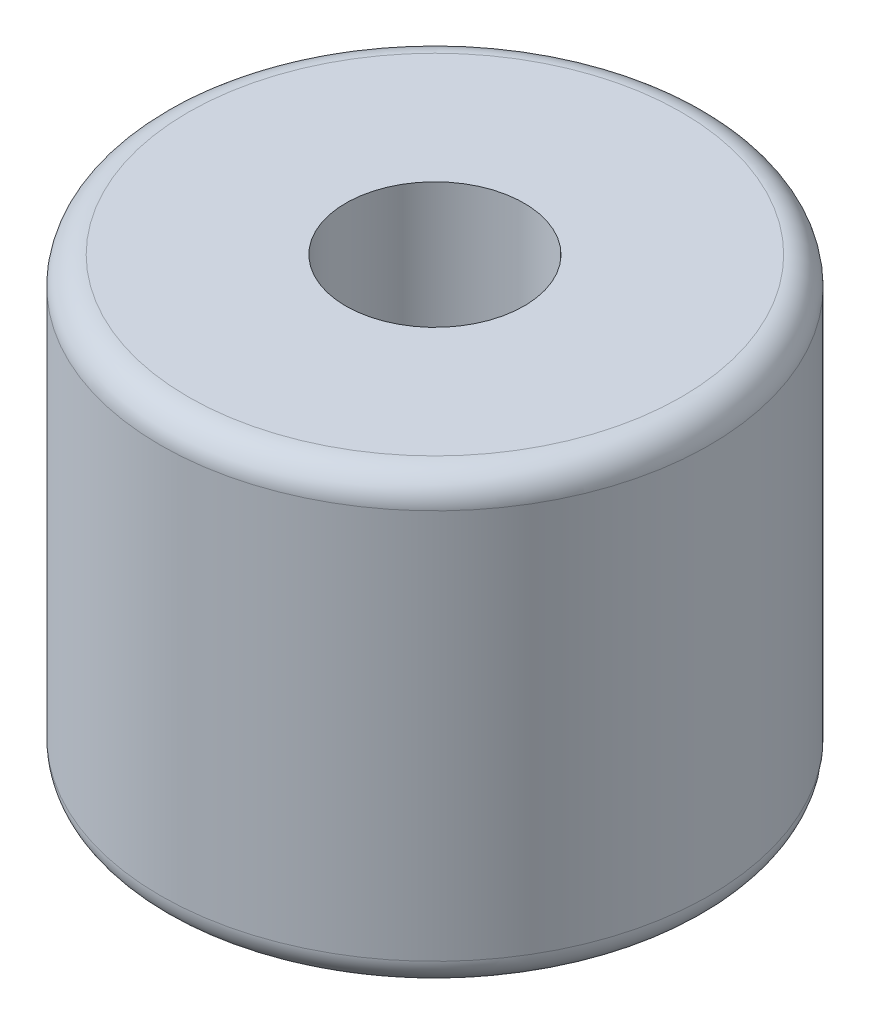
ISO-10303-21;
HEADER;
FILE_DESCRIPTION(('STEP AP214'),'2;1');
FILE_NAME('part.step','',(''),(''),'','','');
FILE_SCHEMA(('AUTOMOTIVE_DESIGN { 1 0 10303 214 1 1 1 1 }'));
ENDSEC;
DATA;
#1=APPLICATION_CONTEXT('core data for automotive mechanical design processes');
#2=APPLICATION_PROTOCOL_DEFINITION('international standard','automotive_design',2000,#1);
#3=PRODUCT_CONTEXT('',#1,'mechanical');
#4=PRODUCT('Part','Part','',(#3));
#5=PRODUCT_RELATED_PRODUCT_CATEGORY('part','',(#4));
#6=PRODUCT_DEFINITION_FORMATION('','',#4);
#7=PRODUCT_DEFINITION_CONTEXT('part definition',#1,'design');
#8=PRODUCT_DEFINITION('design','',#6,#7);
#9=PRODUCT_DEFINITION_SHAPE('','',#8);
#10=(LENGTH_UNIT() NAMED_UNIT(*) SI_UNIT(.MILLI.,.METRE.));
#11=(NAMED_UNIT(*) PLANE_ANGLE_UNIT() SI_UNIT($,.RADIAN.));
#12=(NAMED_UNIT(*) SI_UNIT($,.STERADIAN.) SOLID_ANGLE_UNIT());
#13=UNCERTAINTY_MEASURE_WITH_UNIT(LENGTH_MEASURE(1.E-05),#10,'distance_accuracy_value','');
#14=(GEOMETRIC_REPRESENTATION_CONTEXT(3) GLOBAL_UNCERTAINTY_ASSIGNED_CONTEXT((#13)) GLOBAL_UNIT_ASSIGNED_CONTEXT((#10,
#11,#12)) REPRESENTATION_CONTEXT('',''));
#15=CARTESIAN_POINT('',(0.,0.,0.));
#16=DIRECTION('',(0.,0.,1.));
#17=DIRECTION('',(1.,0.,0.));
#18=AXIS2_PLACEMENT_3D('',#15,#16,#17);
#19=CARTESIAN_POINT('',(0.,8.,0.));
#20=DIRECTION('',(0.,1.,0.));
#21=DIRECTION('',(0.,0.,1.));
#22=AXIS2_PLACEMENT_3D('',#19,#20,#21);
#23=PLANE('',#22);
#24=CARTESIAN_POINT('',(0.,8.,0.));
#25=DIRECTION('',(0.,1.,0.));
#26=DIRECTION('',(0.,0.,1.));
#27=AXIS2_PLACEMENT_3D('',#24,#25,#26);
#28=CIRCLE('',#27,4.425);
#29=CARTESIAN_POINT('',(0.,8.,4.425));
#30=VERTEX_POINT('',#29);
#31=EDGE_CURVE('E65',#30,#30,#28,.T.);
#32=ORIENTED_EDGE('',*,*,#31,.T.);
#33=EDGE_LOOP('',(#32));
#34=FACE_BOUND('',#33,.T.);
#35=CARTESIAN_POINT('',(0.,8.,0.));
#36=DIRECTION('',(0.,1.,0.));
#37=DIRECTION('',(0.,0.,1.));
#38=AXIS2_PLACEMENT_3D('',#35,#36,#37);
#39=CIRCLE('',#38,1.6);
#40=CARTESIAN_POINT('',(0.,8.,1.6));
#41=VERTEX_POINT('',#40);
#42=EDGE_CURVE('E69',#41,#41,#39,.T.);
#43=ORIENTED_EDGE('',*,*,#42,.F.);
#44=EDGE_LOOP('',(#43));
#45=FACE_BOUND('',#44,.T.);
#46=ADVANCED_FACE('F37',(#34,#45),#23,.T.);
#47=CARTESIAN_POINT('',(0.,0.,0.));
#48=DIRECTION('',(0.,1.,0.));
#49=DIRECTION('',(0.,0.,1.));
#50=AXIS2_PLACEMENT_3D('',#47,#48,#49);
#51=PLANE('',#50);
#52=CARTESIAN_POINT('',(0.,0.,0.));
#53=DIRECTION('',(0.,1.,0.));
#54=DIRECTION('',(0.,0.,1.));
#55=AXIS2_PLACEMENT_3D('',#52,#53,#54);
#56=CIRCLE('',#55,2.1);
#57=CARTESIAN_POINT('',(0.,0.,2.1));
#58=VERTEX_POINT('',#57);
#59=EDGE_CURVE('E45',#58,#58,#56,.T.);
#60=ORIENTED_EDGE('',*,*,#59,.T.);
#61=EDGE_LOOP('',(#60));
#62=FACE_BOUND('',#61,.T.);
#63=CARTESIAN_POINT('',(0.,0.,0.));
#64=DIRECTION('',(0.,1.,0.));
#65=DIRECTION('',(0.,0.,1.));
#66=AXIS2_PLACEMENT_3D('',#63,#64,#65);
#67=CIRCLE('',#66,4.425);
#68=CARTESIAN_POINT('',(0.,0.,4.425));
#69=VERTEX_POINT('',#68);
#70=EDGE_CURVE('E50',#69,#69,#67,.F.);
#71=ORIENTED_EDGE('',*,*,#70,.T.);
#72=EDGE_LOOP('',(#71));
#73=FACE_BOUND('',#72,.T.);
#74=ADVANCED_FACE('F77',(#62,#73),#51,.F.);
#75=CARTESIAN_POINT('',(0.,8.,0.));
#76=DIRECTION('',(0.,-1.,0.));
#77=DIRECTION('',(0.,0.,-1.));
#78=AXIS2_PLACEMENT_3D('',#75,#76,#77);
#79=CYLINDRICAL_SURFACE('',#78,4.925);
#80=CARTESIAN_POINT('',(0.,7.5,0.));
#81=DIRECTION('',(0.,1.,0.));
#82=DIRECTION('',(0.,0.,1.));
#83=AXIS2_PLACEMENT_3D('',#80,#81,#82);
#84=CIRCLE('',#83,4.925);
#85=CARTESIAN_POINT('',(0.,7.5,4.925));
#86=VERTEX_POINT('',#85);
#87=EDGE_CURVE('E55',#86,#86,#84,.F.);
#88=ORIENTED_EDGE('',*,*,#87,.T.);
#89=EDGE_LOOP('',(#88));
#90=FACE_BOUND('',#89,.T.);
#91=CARTESIAN_POINT('',(0.,0.5,0.));
#92=DIRECTION('',(0.,1.,0.));
#93=DIRECTION('',(0.,0.,1.));
#94=AXIS2_PLACEMENT_3D('',#91,#92,#93);
#95=CIRCLE('',#94,4.925);
#96=CARTESIAN_POINT('',(0.,0.5,4.925));
#97=VERTEX_POINT('',#96);
#98=EDGE_CURVE('E61',#97,#97,#95,.T.);
#99=ORIENTED_EDGE('',*,*,#98,.T.);
#100=EDGE_LOOP('',(#99));
#101=FACE_BOUND('',#100,.T.);
#102=ADVANCED_FACE('F83',(#90,#101),#79,.T.);
#103=CARTESIAN_POINT('',(0.,8.,0.));
#104=DIRECTION('',(0.,-1.,0.));
#105=DIRECTION('',(0.,0.,-1.));
#106=AXIS2_PLACEMENT_3D('',#103,#104,#105);
#107=CYLINDRICAL_SURFACE('',#106,1.6);
#108=CARTESIAN_POINT('',(0.,0.5,0.));
#109=DIRECTION('',(0.,1.,0.));
#110=DIRECTION('',(0.,0.,1.));
#111=AXIS2_PLACEMENT_3D('',#108,#109,#110);
#112=CIRCLE('',#111,1.6);
#113=CARTESIAN_POINT('',(0.,0.5,1.6));
#114=VERTEX_POINT('',#113);
#115=EDGE_CURVE('E10',#114,#114,#112,.F.);
#116=ORIENTED_EDGE('',*,*,#115,.T.);
#117=EDGE_LOOP('',(#116));
#118=FACE_BOUND('',#117,.T.);
#119=ORIENTED_EDGE('',*,*,#42,.T.);
#120=EDGE_LOOP('',(#119));
#121=FACE_BOUND('',#120,.T.);
#122=ADVANCED_FACE('F74',(#118,#121),#107,.F.);
#123=CARTESIAN_POINT('',(0.,7.5,0.));
#124=DIRECTION('',(0.,1.,0.));
#125=DIRECTION('',(0.,0.,1.));
#126=AXIS2_PLACEMENT_3D('',#123,#124,#125);
#127=TOROIDAL_SURFACE('',#126,4.425,0.5);
#128=ORIENTED_EDGE('',*,*,#87,.F.);
#129=EDGE_LOOP('',(#128));
#130=FACE_BOUND('',#129,.T.);
#131=ORIENTED_EDGE('',*,*,#31,.F.);
#132=EDGE_LOOP('',(#131));
#133=FACE_BOUND('',#132,.T.);
#134=ADVANCED_FACE('F90',(#130,#133),#127,.T.);
#135=CARTESIAN_POINT('',(0.,0.5,0.));
#136=DIRECTION('',(0.,1.,0.));
#137=DIRECTION('',(0.,0.,1.));
#138=AXIS2_PLACEMENT_3D('',#135,#136,#137);
#139=TOROIDAL_SURFACE('',#138,2.1,0.5);
#140=ORIENTED_EDGE('',*,*,#115,.F.);
#141=EDGE_LOOP('',(#140));
#142=FACE_BOUND('',#141,.T.);
#143=ORIENTED_EDGE('',*,*,#59,.F.);
#144=EDGE_LOOP('',(#143));
#145=FACE_BOUND('',#144,.T.);
#146=ADVANCED_FACE('F92',(#142,#145),#139,.T.);
#147=CARTESIAN_POINT('',(0.,0.5,0.));
#148=DIRECTION('',(0.,1.,0.));
#149=DIRECTION('',(0.,0.,1.));
#150=AXIS2_PLACEMENT_3D('',#147,#148,#149);
#151=TOROIDAL_SURFACE('',#150,4.425,0.5);
#152=ORIENTED_EDGE('',*,*,#70,.F.);
#153=EDGE_LOOP('',(#152));
#154=FACE_BOUND('',#153,.T.);
#155=ORIENTED_EDGE('',*,*,#98,.F.);
#156=EDGE_LOOP('',(#155));
#157=FACE_BOUND('',#156,.T.);
#158=ADVANCED_FACE('F39',(#154,#157),#151,.T.);
#159=CLOSED_SHELL('',(#46,#74,#102,#122,#134,#146,#158));
#160=MANIFOLD_SOLID_BREP('B2',#159);
#161=ADVANCED_BREP_SHAPE_REPRESENTATION('',(#18,#160),#14);
#162=SHAPE_DEFINITION_REPRESENTATION(#9,#161);
ENDSEC;
END-ISO-10303-21;
